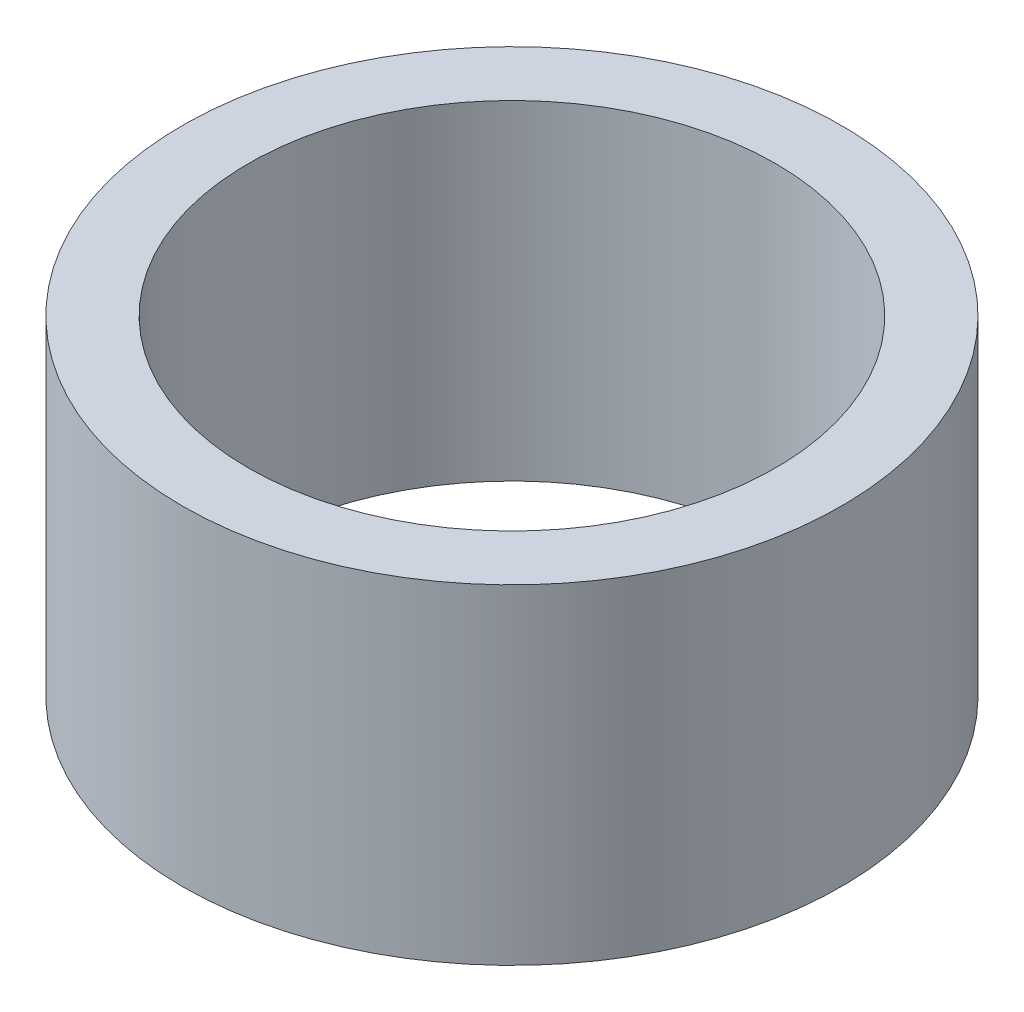
ISO-10303-21;
HEADER;
FILE_DESCRIPTION(('STEP AP214'),'2;1');
FILE_NAME('part.step','',(''),(''),'','','');
FILE_SCHEMA(('AUTOMOTIVE_DESIGN { 1 0 10303 214 1 1 1 1 }'));
ENDSEC;
DATA;
#1=APPLICATION_CONTEXT('core data for automotive mechanical design processes');
#2=APPLICATION_PROTOCOL_DEFINITION('international standard','automotive_design',2000,#1);
#3=PRODUCT_CONTEXT('',#1,'mechanical');
#4=PRODUCT('Part','Part','',(#3));
#5=PRODUCT_RELATED_PRODUCT_CATEGORY('part','',(#4));
#6=PRODUCT_DEFINITION_FORMATION('','',#4);
#7=PRODUCT_DEFINITION_CONTEXT('part definition',#1,'design');
#8=PRODUCT_DEFINITION('design','',#6,#7);
#9=PRODUCT_DEFINITION_SHAPE('','',#8);
#10=(LENGTH_UNIT() NAMED_UNIT(*) SI_UNIT(.MILLI.,.METRE.));
#11=(NAMED_UNIT(*) PLANE_ANGLE_UNIT() SI_UNIT($,.RADIAN.));
#12=(NAMED_UNIT(*) SI_UNIT($,.STERADIAN.) SOLID_ANGLE_UNIT());
#13=UNCERTAINTY_MEASURE_WITH_UNIT(LENGTH_MEASURE(1.E-05),#10,'distance_accuracy_value','');
#14=(GEOMETRIC_REPRESENTATION_CONTEXT(3) GLOBAL_UNCERTAINTY_ASSIGNED_CONTEXT((#13)) GLOBAL_UNIT_ASSIGNED_CONTEXT((#10,
#11,#12)) REPRESENTATION_CONTEXT('',''));
#15=CARTESIAN_POINT('',(0.,0.,0.));
#16=DIRECTION('',(0.,0.,1.));
#17=DIRECTION('',(1.,0.,0.));
#18=AXIS2_PLACEMENT_3D('',#15,#16,#17);
#19=CARTESIAN_POINT('',(0.,5.,0.));
#20=DIRECTION('',(0.,1.,0.));
#21=DIRECTION('',(0.,0.,1.));
#22=AXIS2_PLACEMENT_3D('',#19,#20,#21);
#23=PLANE('',#22);
#24=CARTESIAN_POINT('',(0.,5.,0.));
#25=DIRECTION('',(0.,1.,0.));
#26=DIRECTION('',(0.,0.,1.));
#27=AXIS2_PLACEMENT_3D('',#24,#25,#26);
#28=CIRCLE('',#27,5.);
#29=CARTESIAN_POINT('',(0.,5.,5.));
#30=VERTEX_POINT('',#29);
#31=EDGE_CURVE('E10',#30,#30,#28,.T.);
#32=ORIENTED_EDGE('',*,*,#31,.T.);
#33=EDGE_LOOP('',(#32));
#34=FACE_BOUND('',#33,.T.);
#35=CARTESIAN_POINT('',(0.,5.,0.));
#36=DIRECTION('',(0.,1.,0.));
#37=DIRECTION('',(0.,0.,1.));
#38=AXIS2_PLACEMENT_3D('',#35,#36,#37);
#39=CIRCLE('',#38,4.);
#40=CARTESIAN_POINT('',(0.,5.,4.));
#41=VERTEX_POINT('',#40);
#42=EDGE_CURVE('E49',#41,#41,#39,.T.);
#43=ORIENTED_EDGE('',*,*,#42,.F.);
#44=EDGE_LOOP('',(#43));
#45=FACE_BOUND('',#44,.T.);
#46=ADVANCED_FACE('F36',(#34,#45),#23,.T.);
#47=CARTESIAN_POINT('',(0.,0.,0.));
#48=DIRECTION('',(0.,1.,0.));
#49=DIRECTION('',(0.,0.,1.));
#50=AXIS2_PLACEMENT_3D('',#47,#48,#49);
#51=PLANE('',#50);
#52=CARTESIAN_POINT('',(0.,0.,0.));
#53=DIRECTION('',(0.,1.,0.));
#54=DIRECTION('',(0.,0.,1.));
#55=AXIS2_PLACEMENT_3D('',#52,#53,#54);
#56=CIRCLE('',#55,5.);
#57=CARTESIAN_POINT('',(0.,0.,5.));
#58=VERTEX_POINT('',#57);
#59=EDGE_CURVE('E40',#58,#58,#56,.T.);
#60=ORIENTED_EDGE('',*,*,#59,.F.);
#61=EDGE_LOOP('',(#60));
#62=FACE_BOUND('',#61,.T.);
#63=CARTESIAN_POINT('',(0.,0.,0.));
#64=DIRECTION('',(0.,1.,0.));
#65=DIRECTION('',(0.,0.,1.));
#66=AXIS2_PLACEMENT_3D('',#63,#64,#65);
#67=CIRCLE('',#66,4.);
#68=CARTESIAN_POINT('',(0.,0.,4.));
#69=VERTEX_POINT('',#68);
#70=EDGE_CURVE('E51',#69,#69,#67,.T.);
#71=ORIENTED_EDGE('',*,*,#70,.T.);
#72=EDGE_LOOP('',(#71));
#73=FACE_BOUND('',#72,.T.);
#74=ADVANCED_FACE('F63',(#62,#73),#51,.F.);
#75=CARTESIAN_POINT('',(0.,5.,0.));
#76=DIRECTION('',(0.,-1.,0.));
#77=DIRECTION('',(0.,0.,-1.));
#78=AXIS2_PLACEMENT_3D('',#75,#76,#77);
#79=CYLINDRICAL_SURFACE('',#78,5.);
#80=ORIENTED_EDGE('',*,*,#31,.F.);
#81=EDGE_LOOP('',(#80));
#82=FACE_BOUND('',#81,.T.);
#83=ORIENTED_EDGE('',*,*,#59,.T.);
#84=EDGE_LOOP('',(#83));
#85=FACE_BOUND('',#84,.T.);
#86=ADVANCED_FACE('F38',(#82,#85),#79,.T.);
#87=CARTESIAN_POINT('',(0.,5.,0.));
#88=DIRECTION('',(0.,-1.,0.));
#89=DIRECTION('',(0.,0.,-1.));
#90=AXIS2_PLACEMENT_3D('',#87,#88,#89);
#91=CYLINDRICAL_SURFACE('',#90,4.);
#92=ORIENTED_EDGE('',*,*,#42,.T.);
#93=EDGE_LOOP('',(#92));
#94=FACE_BOUND('',#93,.T.);
#95=ORIENTED_EDGE('',*,*,#70,.F.);
#96=EDGE_LOOP('',(#95));
#97=FACE_BOUND('',#96,.T.);
#98=ADVANCED_FACE('F59',(#94,#97),#91,.F.);
#99=CLOSED_SHELL('',(#46,#74,#86,#98));
#100=MANIFOLD_SOLID_BREP('B2',#99);
#101=ADVANCED_BREP_SHAPE_REPRESENTATION('',(#18,#100),#14);
#102=SHAPE_DEFINITION_REPRESENTATION(#9,#101);
ENDSEC;
END-ISO-10303-21;
